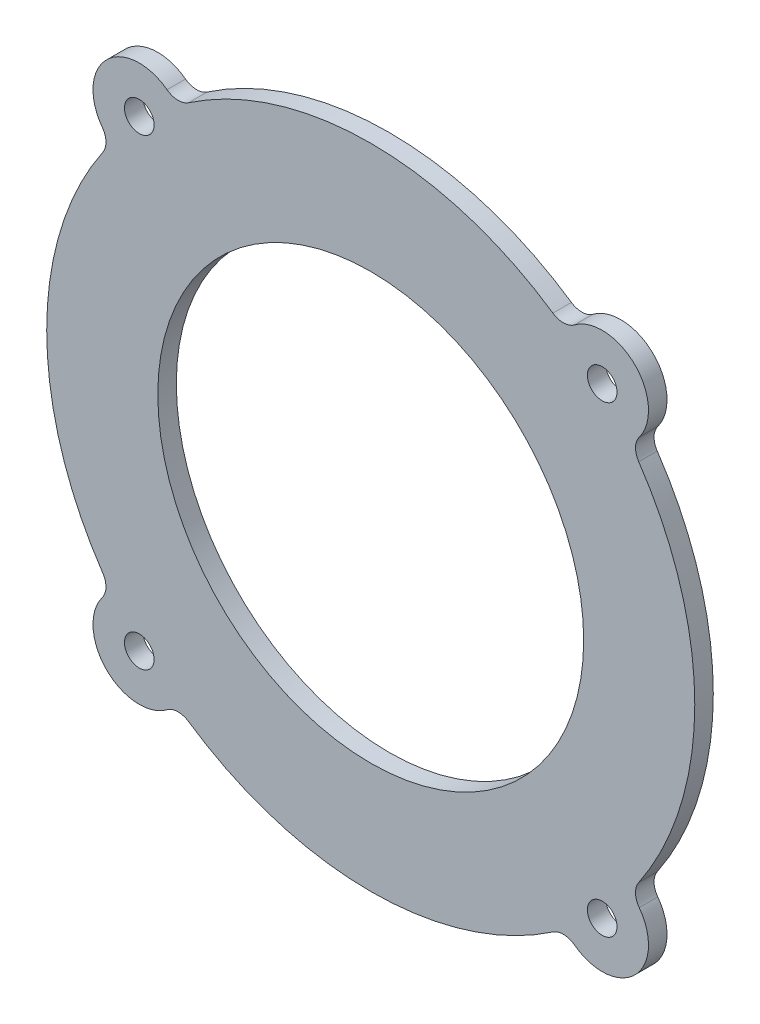
ISO-10303-21;
HEADER;
FILE_DESCRIPTION(('STEP AP214'),'2;1');
FILE_NAME('part.step','',(''),(''),'','','');
FILE_SCHEMA(('AUTOMOTIVE_DESIGN { 1 0 10303 214 1 1 1 1 }'));
ENDSEC;
DATA;
#1=APPLICATION_CONTEXT('core data for automotive mechanical design processes');
#2=APPLICATION_PROTOCOL_DEFINITION('international standard','automotive_design',2000,#1);
#3=PRODUCT_CONTEXT('',#1,'mechanical');
#4=PRODUCT('Part','Part','',(#3));
#5=PRODUCT_RELATED_PRODUCT_CATEGORY('part','',(#4));
#6=PRODUCT_DEFINITION_FORMATION('','',#4);
#7=PRODUCT_DEFINITION_CONTEXT('part definition',#1,'design');
#8=PRODUCT_DEFINITION('design','',#6,#7);
#9=PRODUCT_DEFINITION_SHAPE('','',#8);
#10=(LENGTH_UNIT() NAMED_UNIT(*) SI_UNIT(.MILLI.,.METRE.));
#11=(NAMED_UNIT(*) PLANE_ANGLE_UNIT() SI_UNIT($,.RADIAN.));
#12=(NAMED_UNIT(*) SI_UNIT($,.STERADIAN.) SOLID_ANGLE_UNIT());
#13=UNCERTAINTY_MEASURE_WITH_UNIT(LENGTH_MEASURE(1.E-05),#10,'distance_accuracy_value','');
#14=(GEOMETRIC_REPRESENTATION_CONTEXT(3) GLOBAL_UNCERTAINTY_ASSIGNED_CONTEXT((#13)) GLOBAL_UNIT_ASSIGNED_CONTEXT((#10,
#11,#12)) REPRESENTATION_CONTEXT('',''));
#15=CARTESIAN_POINT('',(0.,0.,0.));
#16=DIRECTION('',(0.,0.,1.));
#17=DIRECTION('',(1.,0.,0.));
#18=AXIS2_PLACEMENT_3D('',#15,#16,#17);
#19=CARTESIAN_POINT('',(-27.8,-22.9,2.));
#20=DIRECTION('',(0.,0.,-1.));
#21=DIRECTION('',(-1.,0.,0.));
#22=AXIS2_PLACEMENT_3D('',#19,#20,#21);
#23=PLANE('',#22);
#24=CARTESIAN_POINT('',(-30.6,-20.8,2.));
#25=DIRECTION('',(0.,0.,-1.));
#26=DIRECTION('',(-1.,0.,0.));
#27=AXIS2_PLACEMENT_3D('',#24,#25,#26);
#28=CIRCLE('',#27,2.);
#29=CARTESIAN_POINT('',(-28.945945945946,-19.6756756756757,2.));
#30=VERTEX_POINT('',#29);
#31=CARTESIAN_POINT('',(-29.,-22.,2.));
#32=VERTEX_POINT('',#31);
#33=EDGE_CURVE('E209',#30,#32,#28,.T.);
#34=ORIENTED_EDGE('',*,*,#33,.T.);
#35=CARTESIAN_POINT('',(-25.,-25.,2.));
#36=DIRECTION('',(0.,0.,1.));
#37=DIRECTION('',(1.,0.,0.));
#38=AXIS2_PLACEMENT_3D('',#35,#36,#37);
#39=CIRCLE('',#38,5.00000000000002);
#40=CARTESIAN_POINT('',(-22.,-29.,2.));
#41=VERTEX_POINT('',#40);
#42=EDGE_CURVE('E117',#32,#41,#39,.T.);
#43=ORIENTED_EDGE('',*,*,#42,.T.);
#44=CARTESIAN_POINT('',(-20.8,-30.6,2.));
#45=DIRECTION('',(0.,0.,-1.));
#46=DIRECTION('',(-1.,0.,0.));
#47=AXIS2_PLACEMENT_3D('',#44,#45,#46);
#48=CIRCLE('',#47,2.);
#49=CARTESIAN_POINT('',(-19.6756756756757,-28.945945945946,2.));
#50=VERTEX_POINT('',#49);
#51=EDGE_CURVE('E248',#41,#50,#48,.T.);
#52=ORIENTED_EDGE('',*,*,#51,.T.);
#53=CARTESIAN_POINT('',(0.,0.,2.));
#54=DIRECTION('',(0.,0.,1.));
#55=DIRECTION('',(1.,0.,0.));
#56=AXIS2_PLACEMENT_3D('',#53,#54,#55);
#57=CIRCLE('',#56,35.);
#58=CARTESIAN_POINT('',(19.6756756756757,-28.945945945946,2.));
#59=VERTEX_POINT('',#58);
#60=EDGE_CURVE('E267',#50,#59,#57,.T.);
#61=ORIENTED_EDGE('',*,*,#60,.T.);
#62=CARTESIAN_POINT('',(20.8,-30.6,2.));
#63=DIRECTION('',(0.,0.,-1.));
#64=DIRECTION('',(-1.,0.,0.));
#65=AXIS2_PLACEMENT_3D('',#62,#63,#64);
#66=CIRCLE('',#65,2.);
#67=CARTESIAN_POINT('',(22.,-29.,2.));
#68=VERTEX_POINT('',#67);
#69=EDGE_CURVE('E264',#59,#68,#66,.T.);
#70=ORIENTED_EDGE('',*,*,#69,.T.);
#71=CARTESIAN_POINT('',(25.,-25.,2.));
#72=DIRECTION('',(0.,0.,1.));
#73=DIRECTION('',(1.,0.,0.));
#74=AXIS2_PLACEMENT_3D('',#71,#72,#73);
#75=CIRCLE('',#74,5.00000000000002);
#76=CARTESIAN_POINT('',(29.,-22.,2.));
#77=VERTEX_POINT('',#76);
#78=EDGE_CURVE('E266',#68,#77,#75,.T.);
#79=ORIENTED_EDGE('',*,*,#78,.T.);
#80=CARTESIAN_POINT('',(30.6,-20.8,2.));
#81=DIRECTION('',(0.,0.,-1.));
#82=DIRECTION('',(-1.,0.,0.));
#83=AXIS2_PLACEMENT_3D('',#80,#81,#82);
#84=CIRCLE('',#83,2.);
#85=CARTESIAN_POINT('',(28.945945945946,-19.6756756756757,2.));
#86=VERTEX_POINT('',#85);
#87=EDGE_CURVE('E269',#77,#86,#84,.T.);
#88=ORIENTED_EDGE('',*,*,#87,.T.);
#89=CARTESIAN_POINT('',(0.,0.,2.));
#90=DIRECTION('',(0.,0.,1.));
#91=DIRECTION('',(1.,0.,0.));
#92=AXIS2_PLACEMENT_3D('',#89,#90,#91);
#93=CIRCLE('',#92,35.);
#94=CARTESIAN_POINT('',(28.9459459459459,19.6756756756757,2.));
#95=VERTEX_POINT('',#94);
#96=EDGE_CURVE('E275',#86,#95,#93,.T.);
#97=ORIENTED_EDGE('',*,*,#96,.T.);
#98=CARTESIAN_POINT('',(30.6,20.8,2.));
#99=DIRECTION('',(0.,0.,-1.));
#100=DIRECTION('',(-1.,0.,0.));
#101=AXIS2_PLACEMENT_3D('',#98,#99,#100);
#102=CIRCLE('',#101,2.);
#103=CARTESIAN_POINT('',(29.,22.,2.));
#104=VERTEX_POINT('',#103);
#105=EDGE_CURVE('E277',#95,#104,#102,.T.);
#106=ORIENTED_EDGE('',*,*,#105,.T.);
#107=CARTESIAN_POINT('',(25.,25.,2.));
#108=DIRECTION('',(0.,0.,1.));
#109=DIRECTION('',(1.,0.,0.));
#110=AXIS2_PLACEMENT_3D('',#107,#108,#109);
#111=CIRCLE('',#110,5.00000000000001);
#112=CARTESIAN_POINT('',(22.,29.,2.));
#113=VERTEX_POINT('',#112);
#114=EDGE_CURVE('E279',#104,#113,#111,.T.);
#115=ORIENTED_EDGE('',*,*,#114,.T.);
#116=CARTESIAN_POINT('',(20.8,30.6,2.));
#117=DIRECTION('',(0.,0.,-1.));
#118=DIRECTION('',(-1.,0.,0.));
#119=AXIS2_PLACEMENT_3D('',#116,#117,#118);
#120=CIRCLE('',#119,2.);
#121=CARTESIAN_POINT('',(19.6756756756757,28.945945945946,2.));
#122=VERTEX_POINT('',#121);
#123=EDGE_CURVE('E281',#113,#122,#120,.T.);
#124=ORIENTED_EDGE('',*,*,#123,.T.);
#125=CARTESIAN_POINT('',(0.,0.,2.));
#126=DIRECTION('',(0.,0.,1.));
#127=DIRECTION('',(1.,0.,0.));
#128=AXIS2_PLACEMENT_3D('',#125,#126,#127);
#129=CIRCLE('',#128,35.);
#130=CARTESIAN_POINT('',(-19.6756756756757,28.9459459459459,2.));
#131=VERTEX_POINT('',#130);
#132=EDGE_CURVE('E283',#122,#131,#129,.T.);
#133=ORIENTED_EDGE('',*,*,#132,.T.);
#134=CARTESIAN_POINT('',(-20.8,30.6,2.));
#135=DIRECTION('',(0.,0.,-1.));
#136=DIRECTION('',(-1.,0.,0.));
#137=AXIS2_PLACEMENT_3D('',#134,#135,#136);
#138=CIRCLE('',#137,2.);
#139=CARTESIAN_POINT('',(-22.,29.,2.));
#140=VERTEX_POINT('',#139);
#141=EDGE_CURVE('E160',#131,#140,#138,.T.);
#142=ORIENTED_EDGE('',*,*,#141,.T.);
#143=CARTESIAN_POINT('',(-25.,25.,2.));
#144=DIRECTION('',(0.,0.,1.));
#145=DIRECTION('',(1.,0.,0.));
#146=AXIS2_PLACEMENT_3D('',#143,#144,#145);
#147=CIRCLE('',#146,4.99999999999999);
#148=CARTESIAN_POINT('',(-29.,22.,2.));
#149=VERTEX_POINT('',#148);
#150=EDGE_CURVE('E154',#140,#149,#147,.T.);
#151=ORIENTED_EDGE('',*,*,#150,.T.);
#152=CARTESIAN_POINT('',(-30.6,20.8,2.));
#153=DIRECTION('',(0.,0.,-1.));
#154=DIRECTION('',(1.,0.,0.));
#155=AXIS2_PLACEMENT_3D('',#152,#153,#154);
#156=CIRCLE('',#155,2.);
#157=CARTESIAN_POINT('',(-28.945945945946,19.6756756756757,2.));
#158=VERTEX_POINT('',#157);
#159=EDGE_CURVE('E158',#149,#158,#156,.T.);
#160=ORIENTED_EDGE('',*,*,#159,.T.);
#161=CARTESIAN_POINT('',(0.,0.,2.));
#162=DIRECTION('',(0.,0.,1.));
#163=DIRECTION('',(1.,0.,0.));
#164=AXIS2_PLACEMENT_3D('',#161,#162,#163);
#165=CIRCLE('',#164,35.);
#166=EDGE_CURVE('E50',#158,#30,#165,.T.);
#167=ORIENTED_EDGE('',*,*,#166,.T.);
#168=EDGE_LOOP('',(#34,#43,#52,#61,#70,#79,#88,#97,#106,#115,#124,#133,#142,#151,#160,#167));
#169=FACE_BOUND('',#168,.T.);
#170=CARTESIAN_POINT('',(0.,0.,2.));
#171=DIRECTION('',(0.,0.,1.));
#172=DIRECTION('',(1.,0.,0.));
#173=AXIS2_PLACEMENT_3D('',#170,#171,#172);
#174=CIRCLE('',#173,23.);
#175=CARTESIAN_POINT('',(23.,0.,2.));
#176=VERTEX_POINT('',#175);
#177=EDGE_CURVE('E182',#176,#176,#174,.T.);
#178=ORIENTED_EDGE('',*,*,#177,.F.);
#179=EDGE_LOOP('',(#178));
#180=FACE_BOUND('',#179,.T.);
#181=CARTESIAN_POINT('',(-25.,25.,2.));
#182=DIRECTION('',(0.,0.,1.));
#183=DIRECTION('',(1.,0.,0.));
#184=AXIS2_PLACEMENT_3D('',#181,#182,#183);
#185=CIRCLE('',#184,1.6);
#186=CARTESIAN_POINT('',(-23.4,25.,2.));
#187=VERTEX_POINT('',#186);
#188=EDGE_CURVE('E357',#187,#187,#185,.T.);
#189=ORIENTED_EDGE('',*,*,#188,.F.);
#190=EDGE_LOOP('',(#189));
#191=FACE_BOUND('',#190,.T.);
#192=CARTESIAN_POINT('',(25.,25.,2.));
#193=DIRECTION('',(0.,0.,1.));
#194=DIRECTION('',(1.,0.,0.));
#195=AXIS2_PLACEMENT_3D('',#192,#193,#194);
#196=CIRCLE('',#195,1.6);
#197=CARTESIAN_POINT('',(26.6,25.,2.));
#198=VERTEX_POINT('',#197);
#199=EDGE_CURVE('E351',#198,#198,#196,.T.);
#200=ORIENTED_EDGE('',*,*,#199,.F.);
#201=EDGE_LOOP('',(#200));
#202=FACE_BOUND('',#201,.T.);
#203=CARTESIAN_POINT('',(-25.,-25.,2.));
#204=DIRECTION('',(0.,0.,1.));
#205=DIRECTION('',(1.,0.,0.));
#206=AXIS2_PLACEMENT_3D('',#203,#204,#205);
#207=CIRCLE('',#206,1.6);
#208=CARTESIAN_POINT('',(-23.4,-25.,2.));
#209=VERTEX_POINT('',#208);
#210=EDGE_CURVE('E345',#209,#209,#207,.T.);
#211=ORIENTED_EDGE('',*,*,#210,.F.);
#212=EDGE_LOOP('',(#211));
#213=FACE_BOUND('',#212,.T.);
#214=CARTESIAN_POINT('',(25.,-25.,2.));
#215=DIRECTION('',(0.,0.,1.));
#216=DIRECTION('',(1.,0.,0.));
#217=AXIS2_PLACEMENT_3D('',#214,#215,#216);
#218=CIRCLE('',#217,1.6);
#219=CARTESIAN_POINT('',(26.6,-25.,2.));
#220=VERTEX_POINT('',#219);
#221=EDGE_CURVE('E336',#220,#220,#218,.T.);
#222=ORIENTED_EDGE('',*,*,#221,.F.);
#223=EDGE_LOOP('',(#222));
#224=FACE_BOUND('',#223,.T.);
#225=ADVANCED_FACE('F33',(#169,#180,#191,#202,#213,#224),#23,.F.);
#226=CARTESIAN_POINT('',(-27.8,-22.9,0.));
#227=DIRECTION('',(0.,0.,-1.));
#228=DIRECTION('',(-1.,0.,0.));
#229=AXIS2_PLACEMENT_3D('',#226,#227,#228);
#230=PLANE('',#229);
#231=CARTESIAN_POINT('',(-25.,-25.,0.));
#232=DIRECTION('',(0.,0.,1.));
#233=DIRECTION('',(1.,0.,0.));
#234=AXIS2_PLACEMENT_3D('',#231,#232,#233);
#235=CIRCLE('',#234,1.6);
#236=CARTESIAN_POINT('',(-23.4,-25.,0.));
#237=VERTEX_POINT('',#236);
#238=EDGE_CURVE('E342',#237,#237,#235,.T.);
#239=ORIENTED_EDGE('',*,*,#238,.T.);
#240=EDGE_LOOP('',(#239));
#241=FACE_BOUND('',#240,.T.);
#242=CARTESIAN_POINT('',(-25.,25.,0.));
#243=DIRECTION('',(0.,0.,1.));
#244=DIRECTION('',(1.,0.,0.));
#245=AXIS2_PLACEMENT_3D('',#242,#243,#244);
#246=CIRCLE('',#245,1.6);
#247=CARTESIAN_POINT('',(-23.4,25.,0.));
#248=VERTEX_POINT('',#247);
#249=EDGE_CURVE('E354',#248,#248,#246,.T.);
#250=ORIENTED_EDGE('',*,*,#249,.T.);
#251=EDGE_LOOP('',(#250));
#252=FACE_BOUND('',#251,.T.);
#253=CARTESIAN_POINT('',(-30.6,-20.8,0.));
#254=DIRECTION('',(0.,0.,-1.));
#255=DIRECTION('',(-1.,0.,0.));
#256=AXIS2_PLACEMENT_3D('',#253,#254,#255);
#257=CIRCLE('',#256,2.);
#258=CARTESIAN_POINT('',(-28.945945945946,-19.6756756756757,0.));
#259=VERTEX_POINT('',#258);
#260=CARTESIAN_POINT('',(-29.,-22.,0.));
#261=VERTEX_POINT('',#260);
#262=EDGE_CURVE('E178',#259,#261,#257,.T.);
#263=ORIENTED_EDGE('',*,*,#262,.F.);
#264=CARTESIAN_POINT('',(0.,0.,0.));
#265=DIRECTION('',(0.,0.,1.));
#266=DIRECTION('',(1.,0.,0.));
#267=AXIS2_PLACEMENT_3D('',#264,#265,#266);
#268=CIRCLE('',#267,35.);
#269=CARTESIAN_POINT('',(-28.945945945946,19.6756756756757,0.));
#270=VERTEX_POINT('',#269);
#271=EDGE_CURVE('E109',#270,#259,#268,.T.);
#272=ORIENTED_EDGE('',*,*,#271,.F.);
#273=CARTESIAN_POINT('',(-30.6,20.8,0.));
#274=DIRECTION('',(0.,0.,-1.));
#275=DIRECTION('',(1.,0.,0.));
#276=AXIS2_PLACEMENT_3D('',#273,#274,#275);
#277=CIRCLE('',#276,2.);
#278=CARTESIAN_POINT('',(-29.,22.,0.));
#279=VERTEX_POINT('',#278);
#280=EDGE_CURVE('E103',#279,#270,#277,.T.);
#281=ORIENTED_EDGE('',*,*,#280,.F.);
#282=CARTESIAN_POINT('',(-25.,25.,0.));
#283=DIRECTION('',(0.,0.,1.));
#284=DIRECTION('',(1.,0.,0.));
#285=AXIS2_PLACEMENT_3D('',#282,#283,#284);
#286=CIRCLE('',#285,4.99999999999999);
#287=CARTESIAN_POINT('',(-22.,29.,0.));
#288=VERTEX_POINT('',#287);
#289=EDGE_CURVE('E168',#288,#279,#286,.T.);
#290=ORIENTED_EDGE('',*,*,#289,.F.);
#291=CARTESIAN_POINT('',(-20.8,30.6,0.));
#292=DIRECTION('',(0.,0.,-1.));
#293=DIRECTION('',(-1.,0.,0.));
#294=AXIS2_PLACEMENT_3D('',#291,#292,#293);
#295=CIRCLE('',#294,2.);
#296=CARTESIAN_POINT('',(-19.6756756756757,28.9459459459459,0.));
#297=VERTEX_POINT('',#296);
#298=EDGE_CURVE('E204',#297,#288,#295,.T.);
#299=ORIENTED_EDGE('',*,*,#298,.F.);
#300=CARTESIAN_POINT('',(0.,0.,0.));
#301=DIRECTION('',(0.,0.,1.));
#302=DIRECTION('',(1.,0.,0.));
#303=AXIS2_PLACEMENT_3D('',#300,#301,#302);
#304=CIRCLE('',#303,35.);
#305=CARTESIAN_POINT('',(19.6756756756757,28.945945945946,0.));
#306=VERTEX_POINT('',#305);
#307=EDGE_CURVE('E202',#306,#297,#304,.T.);
#308=ORIENTED_EDGE('',*,*,#307,.F.);
#309=CARTESIAN_POINT('',(20.8,30.6,0.));
#310=DIRECTION('',(0.,0.,-1.));
#311=DIRECTION('',(-1.,0.,0.));
#312=AXIS2_PLACEMENT_3D('',#309,#310,#311);
#313=CIRCLE('',#312,2.);
#314=CARTESIAN_POINT('',(22.,29.,0.));
#315=VERTEX_POINT('',#314);
#316=EDGE_CURVE('E200',#315,#306,#313,.T.);
#317=ORIENTED_EDGE('',*,*,#316,.F.);
#318=CARTESIAN_POINT('',(25.,25.,0.));
#319=DIRECTION('',(0.,0.,1.));
#320=DIRECTION('',(1.,0.,0.));
#321=AXIS2_PLACEMENT_3D('',#318,#319,#320);
#322=CIRCLE('',#321,5.00000000000001);
#323=CARTESIAN_POINT('',(29.,22.,0.));
#324=VERTEX_POINT('',#323);
#325=EDGE_CURVE('E198',#324,#315,#322,.T.);
#326=ORIENTED_EDGE('',*,*,#325,.F.);
#327=CARTESIAN_POINT('',(30.6,20.8,0.));
#328=DIRECTION('',(0.,0.,-1.));
#329=DIRECTION('',(-1.,0.,0.));
#330=AXIS2_PLACEMENT_3D('',#327,#328,#329);
#331=CIRCLE('',#330,2.);
#332=CARTESIAN_POINT('',(28.9459459459459,19.6756756756757,0.));
#333=VERTEX_POINT('',#332);
#334=EDGE_CURVE('E196',#333,#324,#331,.T.);
#335=ORIENTED_EDGE('',*,*,#334,.F.);
#336=CARTESIAN_POINT('',(0.,0.,0.));
#337=DIRECTION('',(0.,0.,1.));
#338=DIRECTION('',(1.,0.,0.));
#339=AXIS2_PLACEMENT_3D('',#336,#337,#338);
#340=CIRCLE('',#339,35.);
#341=CARTESIAN_POINT('',(28.945945945946,-19.6756756756757,0.));
#342=VERTEX_POINT('',#341);
#343=EDGE_CURVE('E194',#342,#333,#340,.T.);
#344=ORIENTED_EDGE('',*,*,#343,.F.);
#345=CARTESIAN_POINT('',(30.6,-20.8,0.));
#346=DIRECTION('',(0.,0.,-1.));
#347=DIRECTION('',(-1.,0.,0.));
#348=AXIS2_PLACEMENT_3D('',#345,#346,#347);
#349=CIRCLE('',#348,2.);
#350=CARTESIAN_POINT('',(29.,-22.,0.));
#351=VERTEX_POINT('',#350);
#352=EDGE_CURVE('E192',#351,#342,#349,.T.);
#353=ORIENTED_EDGE('',*,*,#352,.F.);
#354=CARTESIAN_POINT('',(25.,-25.,0.));
#355=DIRECTION('',(0.,0.,1.));
#356=DIRECTION('',(1.,0.,0.));
#357=AXIS2_PLACEMENT_3D('',#354,#355,#356);
#358=CIRCLE('',#357,5.00000000000002);
#359=CARTESIAN_POINT('',(22.,-29.,0.));
#360=VERTEX_POINT('',#359);
#361=EDGE_CURVE('E190',#360,#351,#358,.T.);
#362=ORIENTED_EDGE('',*,*,#361,.F.);
#363=CARTESIAN_POINT('',(20.8,-30.6,0.));
#364=DIRECTION('',(0.,0.,-1.));
#365=DIRECTION('',(-1.,0.,0.));
#366=AXIS2_PLACEMENT_3D('',#363,#364,#365);
#367=CIRCLE('',#366,2.);
#368=CARTESIAN_POINT('',(19.6756756756757,-28.945945945946,0.));
#369=VERTEX_POINT('',#368);
#370=EDGE_CURVE('E188',#369,#360,#367,.T.);
#371=ORIENTED_EDGE('',*,*,#370,.F.);
#372=CARTESIAN_POINT('',(0.,0.,0.));
#373=DIRECTION('',(0.,0.,1.));
#374=DIRECTION('',(1.,0.,0.));
#375=AXIS2_PLACEMENT_3D('',#372,#373,#374);
#376=CIRCLE('',#375,35.);
#377=CARTESIAN_POINT('',(-19.6756756756757,-28.945945945946,0.));
#378=VERTEX_POINT('',#377);
#379=EDGE_CURVE('E186',#378,#369,#376,.T.);
#380=ORIENTED_EDGE('',*,*,#379,.F.);
#381=CARTESIAN_POINT('',(-20.8,-30.6,0.));
#382=DIRECTION('',(0.,0.,-1.));
#383=DIRECTION('',(-1.,0.,0.));
#384=AXIS2_PLACEMENT_3D('',#381,#382,#383);
#385=CIRCLE('',#384,2.);
#386=CARTESIAN_POINT('',(-22.,-29.,0.));
#387=VERTEX_POINT('',#386);
#388=EDGE_CURVE('E184',#387,#378,#385,.T.);
#389=ORIENTED_EDGE('',*,*,#388,.F.);
#390=CARTESIAN_POINT('',(-25.,-25.,0.));
#391=DIRECTION('',(0.,0.,1.));
#392=DIRECTION('',(1.,0.,0.));
#393=AXIS2_PLACEMENT_3D('',#390,#391,#392);
#394=CIRCLE('',#393,5.00000000000002);
#395=EDGE_CURVE('E181',#261,#387,#394,.T.);
#396=ORIENTED_EDGE('',*,*,#395,.F.);
#397=EDGE_LOOP('',(#263,#272,#281,#290,#299,#308,#317,#326,#335,#344,#353,#362,#371,#380,#389,#396));
#398=FACE_BOUND('',#397,.T.);
#399=CARTESIAN_POINT('',(0.,0.,0.));
#400=DIRECTION('',(0.,0.,1.));
#401=DIRECTION('',(1.,0.,0.));
#402=AXIS2_PLACEMENT_3D('',#399,#400,#401);
#403=CIRCLE('',#402,23.);
#404=CARTESIAN_POINT('',(23.,0.,0.));
#405=VERTEX_POINT('',#404);
#406=EDGE_CURVE('E360',#405,#405,#403,.T.);
#407=ORIENTED_EDGE('',*,*,#406,.T.);
#408=EDGE_LOOP('',(#407));
#409=FACE_BOUND('',#408,.T.);
#410=CARTESIAN_POINT('',(25.,25.,0.));
#411=DIRECTION('',(0.,0.,1.));
#412=DIRECTION('',(1.,0.,0.));
#413=AXIS2_PLACEMENT_3D('',#410,#411,#412);
#414=CIRCLE('',#413,1.6);
#415=CARTESIAN_POINT('',(26.6,25.,0.));
#416=VERTEX_POINT('',#415);
#417=EDGE_CURVE('E348',#416,#416,#414,.T.);
#418=ORIENTED_EDGE('',*,*,#417,.T.);
#419=EDGE_LOOP('',(#418));
#420=FACE_BOUND('',#419,.T.);
#421=CARTESIAN_POINT('',(25.,-25.,0.));
#422=DIRECTION('',(0.,0.,1.));
#423=DIRECTION('',(1.,0.,0.));
#424=AXIS2_PLACEMENT_3D('',#421,#422,#423);
#425=CIRCLE('',#424,1.6);
#426=CARTESIAN_POINT('',(26.6,-25.,0.));
#427=VERTEX_POINT('',#426);
#428=EDGE_CURVE('E339',#427,#427,#425,.T.);
#429=ORIENTED_EDGE('',*,*,#428,.T.);
#430=EDGE_LOOP('',(#429));
#431=FACE_BOUND('',#430,.T.);
#432=ADVANCED_FACE('F252',(#241,#252,#398,#409,#420,#431),#230,.T.);
#433=CARTESIAN_POINT('',(-30.6,-20.8,2.));
#434=DIRECTION('',(0.,0.,-1.));
#435=DIRECTION('',(-1.,0.,0.));
#436=AXIS2_PLACEMENT_3D('',#433,#434,#435);
#437=CYLINDRICAL_SURFACE('',#436,2.);
#438=ORIENTED_EDGE('',*,*,#262,.T.);
#439=DIRECTION('',(0.,0.,-1.));
#440=VECTOR('',#439,1.);
#441=CARTESIAN_POINT('',(-29.,-22.,2.));
#442=LINE('',#441,#440);
#443=EDGE_CURVE('E11',#32,#261,#442,.T.);
#444=ORIENTED_EDGE('',*,*,#443,.F.);
#445=ORIENTED_EDGE('',*,*,#33,.F.);
#446=DIRECTION('',(0.,0.,-1.));
#447=VECTOR('',#446,1.);
#448=CARTESIAN_POINT('',(-28.945945945946,-19.6756756756757,2.));
#449=LINE('',#448,#447);
#450=EDGE_CURVE('E174',#30,#259,#449,.T.);
#451=ORIENTED_EDGE('',*,*,#450,.T.);
#452=EDGE_LOOP('',(#438,#444,#445,#451));
#453=FACE_BOUND('',#452,.T.);
#454=ADVANCED_FACE('F35',(#453),#437,.F.);
#455=CARTESIAN_POINT('',(-25.,-25.,2.));
#456=DIRECTION('',(0.,0.,-1.));
#457=DIRECTION('',(-1.,0.,0.));
#458=AXIS2_PLACEMENT_3D('',#455,#456,#457);
#459=CYLINDRICAL_SURFACE('',#458,5.00000000000002);
#460=ORIENTED_EDGE('',*,*,#395,.T.);
#461=DIRECTION('',(0.,0.,-1.));
#462=VECTOR('',#461,1.);
#463=CARTESIAN_POINT('',(-22.,-29.,2.));
#464=LINE('',#463,#462);
#465=EDGE_CURVE('E42',#41,#387,#464,.T.);
#466=ORIENTED_EDGE('',*,*,#465,.F.);
#467=ORIENTED_EDGE('',*,*,#42,.F.);
#468=ORIENTED_EDGE('',*,*,#443,.T.);
#469=EDGE_LOOP('',(#460,#466,#467,#468));
#470=FACE_BOUND('',#469,.T.);
#471=ADVANCED_FACE('F521',(#470),#459,.T.);
#472=CARTESIAN_POINT('',(-20.8,-30.6,2.));
#473=DIRECTION('',(0.,0.,-1.));
#474=DIRECTION('',(-1.,0.,0.));
#475=AXIS2_PLACEMENT_3D('',#472,#473,#474);
#476=CYLINDRICAL_SURFACE('',#475,2.);
#477=ORIENTED_EDGE('',*,*,#388,.T.);
#478=DIRECTION('',(0.,0.,-1.));
#479=VECTOR('',#478,1.);
#480=CARTESIAN_POINT('',(-19.6756756756757,-28.945945945946,2.));
#481=LINE('',#480,#479);
#482=EDGE_CURVE('E240',#50,#378,#481,.T.);
#483=ORIENTED_EDGE('',*,*,#482,.F.);
#484=ORIENTED_EDGE('',*,*,#51,.F.);
#485=ORIENTED_EDGE('',*,*,#465,.T.);
#486=EDGE_LOOP('',(#477,#483,#484,#485));
#487=FACE_BOUND('',#486,.T.);
#488=ADVANCED_FACE('F246',(#487),#476,.F.);
#489=CARTESIAN_POINT('',(0.,0.,2.));
#490=DIRECTION('',(0.,0.,-1.));
#491=DIRECTION('',(-1.,0.,0.));
#492=AXIS2_PLACEMENT_3D('',#489,#490,#491);
#493=CYLINDRICAL_SURFACE('',#492,35.);
#494=ORIENTED_EDGE('',*,*,#379,.T.);
#495=DIRECTION('',(0.,0.,-1.));
#496=VECTOR('',#495,1.);
#497=CARTESIAN_POINT('',(19.6756756756757,-28.945945945946,2.));
#498=LINE('',#497,#496);
#499=EDGE_CURVE('E237',#59,#369,#498,.T.);
#500=ORIENTED_EDGE('',*,*,#499,.F.);
#501=ORIENTED_EDGE('',*,*,#60,.F.);
#502=ORIENTED_EDGE('',*,*,#482,.T.);
#503=EDGE_LOOP('',(#494,#500,#501,#502));
#504=FACE_BOUND('',#503,.T.);
#505=ADVANCED_FACE('F258',(#504),#493,.T.);
#506=CARTESIAN_POINT('',(20.8,-30.6,2.));
#507=DIRECTION('',(0.,0.,-1.));
#508=DIRECTION('',(-1.,0.,0.));
#509=AXIS2_PLACEMENT_3D('',#506,#507,#508);
#510=CYLINDRICAL_SURFACE('',#509,2.);
#511=ORIENTED_EDGE('',*,*,#370,.T.);
#512=DIRECTION('',(0.,0.,-1.));
#513=VECTOR('',#512,1.);
#514=CARTESIAN_POINT('',(22.,-29.,2.));
#515=LINE('',#514,#513);
#516=EDGE_CURVE('E234',#68,#360,#515,.T.);
#517=ORIENTED_EDGE('',*,*,#516,.F.);
#518=ORIENTED_EDGE('',*,*,#69,.F.);
#519=ORIENTED_EDGE('',*,*,#499,.T.);
#520=EDGE_LOOP('',(#511,#517,#518,#519));
#521=FACE_BOUND('',#520,.T.);
#522=ADVANCED_FACE('F262',(#521),#510,.F.);
#523=CARTESIAN_POINT('',(25.,-25.,2.));
#524=DIRECTION('',(0.,0.,-1.));
#525=DIRECTION('',(-1.,0.,0.));
#526=AXIS2_PLACEMENT_3D('',#523,#524,#525);
#527=CYLINDRICAL_SURFACE('',#526,5.00000000000002);
#528=ORIENTED_EDGE('',*,*,#361,.T.);
#529=DIRECTION('',(0.,0.,-1.));
#530=VECTOR('',#529,1.);
#531=CARTESIAN_POINT('',(29.,-22.,2.));
#532=LINE('',#531,#530);
#533=EDGE_CURVE('E231',#77,#351,#532,.T.);
#534=ORIENTED_EDGE('',*,*,#533,.F.);
#535=ORIENTED_EDGE('',*,*,#78,.F.);
#536=ORIENTED_EDGE('',*,*,#516,.T.);
#537=EDGE_LOOP('',(#528,#534,#535,#536));
#538=FACE_BOUND('',#537,.T.);
#539=ADVANCED_FACE('F486',(#538),#527,.T.);
#540=CARTESIAN_POINT('',(30.6,-20.8,2.));
#541=DIRECTION('',(0.,0.,-1.));
#542=DIRECTION('',(-1.,0.,0.));
#543=AXIS2_PLACEMENT_3D('',#540,#541,#542);
#544=CYLINDRICAL_SURFACE('',#543,2.);
#545=ORIENTED_EDGE('',*,*,#352,.T.);
#546=DIRECTION('',(0.,0.,-1.));
#547=VECTOR('',#546,1.);
#548=CARTESIAN_POINT('',(28.945945945946,-19.6756756756757,2.));
#549=LINE('',#548,#547);
#550=EDGE_CURVE('E228',#86,#342,#549,.T.);
#551=ORIENTED_EDGE('',*,*,#550,.F.);
#552=ORIENTED_EDGE('',*,*,#87,.F.);
#553=ORIENTED_EDGE('',*,*,#533,.T.);
#554=EDGE_LOOP('',(#545,#551,#552,#553));
#555=FACE_BOUND('',#554,.T.);
#556=ADVANCED_FACE('F476',(#555),#544,.F.);
#557=CARTESIAN_POINT('',(0.,0.,2.));
#558=DIRECTION('',(0.,0.,-1.));
#559=DIRECTION('',(-1.,0.,0.));
#560=AXIS2_PLACEMENT_3D('',#557,#558,#559);
#561=CYLINDRICAL_SURFACE('',#560,35.);
#562=ORIENTED_EDGE('',*,*,#343,.T.);
#563=DIRECTION('',(0.,0.,-1.));
#564=VECTOR('',#563,1.);
#565=CARTESIAN_POINT('',(28.9459459459459,19.6756756756757,2.));
#566=LINE('',#565,#564);
#567=EDGE_CURVE('E225',#95,#333,#566,.T.);
#568=ORIENTED_EDGE('',*,*,#567,.F.);
#569=ORIENTED_EDGE('',*,*,#96,.F.);
#570=ORIENTED_EDGE('',*,*,#550,.T.);
#571=EDGE_LOOP('',(#562,#568,#569,#570));
#572=FACE_BOUND('',#571,.T.);
#573=ADVANCED_FACE('F466',(#572),#561,.T.);
#574=CARTESIAN_POINT('',(30.6,20.8,2.));
#575=DIRECTION('',(0.,0.,-1.));
#576=DIRECTION('',(-1.,0.,0.));
#577=AXIS2_PLACEMENT_3D('',#574,#575,#576);
#578=CYLINDRICAL_SURFACE('',#577,2.);
#579=ORIENTED_EDGE('',*,*,#334,.T.);
#580=DIRECTION('',(0.,0.,-1.));
#581=VECTOR('',#580,1.);
#582=CARTESIAN_POINT('',(29.,22.,2.));
#583=LINE('',#582,#581);
#584=EDGE_CURVE('E222',#104,#324,#583,.T.);
#585=ORIENTED_EDGE('',*,*,#584,.F.);
#586=ORIENTED_EDGE('',*,*,#105,.F.);
#587=ORIENTED_EDGE('',*,*,#567,.T.);
#588=EDGE_LOOP('',(#579,#585,#586,#587));
#589=FACE_BOUND('',#588,.T.);
#590=ADVANCED_FACE('F456',(#589),#578,.F.);
#591=CARTESIAN_POINT('',(25.,25.,2.));
#592=DIRECTION('',(0.,0.,-1.));
#593=DIRECTION('',(-1.,0.,0.));
#594=AXIS2_PLACEMENT_3D('',#591,#592,#593);
#595=CYLINDRICAL_SURFACE('',#594,5.00000000000001);
#596=ORIENTED_EDGE('',*,*,#325,.T.);
#597=DIRECTION('',(0.,0.,-1.));
#598=VECTOR('',#597,1.);
#599=CARTESIAN_POINT('',(22.,29.,2.));
#600=LINE('',#599,#598);
#601=EDGE_CURVE('E219',#113,#315,#600,.T.);
#602=ORIENTED_EDGE('',*,*,#601,.F.);
#603=ORIENTED_EDGE('',*,*,#114,.F.);
#604=ORIENTED_EDGE('',*,*,#584,.T.);
#605=EDGE_LOOP('',(#596,#602,#603,#604));
#606=FACE_BOUND('',#605,.T.);
#607=ADVANCED_FACE('F446',(#606),#595,.T.);
#608=CARTESIAN_POINT('',(20.8,30.6,2.));
#609=DIRECTION('',(0.,0.,-1.));
#610=DIRECTION('',(-1.,0.,0.));
#611=AXIS2_PLACEMENT_3D('',#608,#609,#610);
#612=CYLINDRICAL_SURFACE('',#611,2.);
#613=ORIENTED_EDGE('',*,*,#316,.T.);
#614=DIRECTION('',(0.,0.,-1.));
#615=VECTOR('',#614,1.);
#616=CARTESIAN_POINT('',(19.6756756756757,28.945945945946,2.));
#617=LINE('',#616,#615);
#618=EDGE_CURVE('E216',#122,#306,#617,.T.);
#619=ORIENTED_EDGE('',*,*,#618,.F.);
#620=ORIENTED_EDGE('',*,*,#123,.F.);
#621=ORIENTED_EDGE('',*,*,#601,.T.);
#622=EDGE_LOOP('',(#613,#619,#620,#621));
#623=FACE_BOUND('',#622,.T.);
#624=ADVANCED_FACE('F437',(#623),#612,.F.);
#625=CARTESIAN_POINT('',(0.,0.,2.));
#626=DIRECTION('',(0.,0.,-1.));
#627=DIRECTION('',(-1.,0.,0.));
#628=AXIS2_PLACEMENT_3D('',#625,#626,#627);
#629=CYLINDRICAL_SURFACE('',#628,35.);
#630=ORIENTED_EDGE('',*,*,#307,.T.);
#631=DIRECTION('',(0.,0.,-1.));
#632=VECTOR('',#631,1.);
#633=CARTESIAN_POINT('',(-19.6756756756757,28.9459459459459,2.));
#634=LINE('',#633,#632);
#635=EDGE_CURVE('E213',#131,#297,#634,.T.);
#636=ORIENTED_EDGE('',*,*,#635,.F.);
#637=ORIENTED_EDGE('',*,*,#132,.F.);
#638=ORIENTED_EDGE('',*,*,#618,.T.);
#639=EDGE_LOOP('',(#630,#636,#637,#638));
#640=FACE_BOUND('',#639,.T.);
#641=ADVANCED_FACE('F289',(#640),#629,.T.);
#642=CARTESIAN_POINT('',(-20.8,30.6,2.));
#643=DIRECTION('',(0.,0.,-1.));
#644=DIRECTION('',(-1.,0.,0.));
#645=AXIS2_PLACEMENT_3D('',#642,#643,#644);
#646=CYLINDRICAL_SURFACE('',#645,2.);
#647=ORIENTED_EDGE('',*,*,#298,.T.);
#648=DIRECTION('',(0.,0.,-1.));
#649=VECTOR('',#648,1.);
#650=CARTESIAN_POINT('',(-22.,29.,2.));
#651=LINE('',#650,#649);
#652=EDGE_CURVE('E169',#140,#288,#651,.T.);
#653=ORIENTED_EDGE('',*,*,#652,.F.);
#654=ORIENTED_EDGE('',*,*,#141,.F.);
#655=ORIENTED_EDGE('',*,*,#635,.T.);
#656=EDGE_LOOP('',(#647,#653,#654,#655));
#657=FACE_BOUND('',#656,.T.);
#658=ADVANCED_FACE('F293',(#657),#646,.F.);
#659=CARTESIAN_POINT('',(-25.,25.,2.));
#660=DIRECTION('',(0.,0.,-1.));
#661=DIRECTION('',(-1.,0.,0.));
#662=AXIS2_PLACEMENT_3D('',#659,#660,#661);
#663=CYLINDRICAL_SURFACE('',#662,4.99999999999999);
#664=ORIENTED_EDGE('',*,*,#289,.T.);
#665=DIRECTION('',(0.,0.,-1.));
#666=VECTOR('',#665,1.);
#667=CARTESIAN_POINT('',(-29.,22.,2.));
#668=LINE('',#667,#666);
#669=EDGE_CURVE('E165',#149,#279,#668,.T.);
#670=ORIENTED_EDGE('',*,*,#669,.F.);
#671=ORIENTED_EDGE('',*,*,#150,.F.);
#672=ORIENTED_EDGE('',*,*,#652,.T.);
#673=EDGE_LOOP('',(#664,#670,#671,#672));
#674=FACE_BOUND('',#673,.T.);
#675=ADVANCED_FACE('F166',(#674),#663,.T.);
#676=CARTESIAN_POINT('',(-30.6,20.8,2.));
#677=DIRECTION('',(0.,0.,-1.));
#678=DIRECTION('',(-1.,0.,0.));
#679=AXIS2_PLACEMENT_3D('',#676,#677,#678);
#680=CYLINDRICAL_SURFACE('',#679,2.);
#681=ORIENTED_EDGE('',*,*,#280,.T.);
#682=DIRECTION('',(0.,0.,-1.));
#683=VECTOR('',#682,1.);
#684=CARTESIAN_POINT('',(-28.945945945946,19.6756756756757,2.));
#685=LINE('',#684,#683);
#686=EDGE_CURVE('E170',#158,#270,#685,.T.);
#687=ORIENTED_EDGE('',*,*,#686,.F.);
#688=ORIENTED_EDGE('',*,*,#159,.F.);
#689=ORIENTED_EDGE('',*,*,#669,.T.);
#690=EDGE_LOOP('',(#681,#687,#688,#689));
#691=FACE_BOUND('',#690,.T.);
#692=ADVANCED_FACE('F172',(#691),#680,.F.);
#693=CARTESIAN_POINT('',(0.,0.,2.));
#694=DIRECTION('',(0.,0.,-1.));
#695=DIRECTION('',(-1.,0.,0.));
#696=AXIS2_PLACEMENT_3D('',#693,#694,#695);
#697=CYLINDRICAL_SURFACE('',#696,35.);
#698=ORIENTED_EDGE('',*,*,#271,.T.);
#699=ORIENTED_EDGE('',*,*,#450,.F.);
#700=ORIENTED_EDGE('',*,*,#166,.F.);
#701=ORIENTED_EDGE('',*,*,#686,.T.);
#702=EDGE_LOOP('',(#698,#699,#700,#701));
#703=FACE_BOUND('',#702,.T.);
#704=ADVANCED_FACE('F297',(#703),#697,.T.);
#705=CARTESIAN_POINT('',(0.,0.,2.));
#706=DIRECTION('',(0.,0.,-1.));
#707=DIRECTION('',(-1.,0.,0.));
#708=AXIS2_PLACEMENT_3D('',#705,#706,#707);
#709=CYLINDRICAL_SURFACE('',#708,23.);
#710=ORIENTED_EDGE('',*,*,#177,.T.);
#711=EDGE_LOOP('',(#710));
#712=FACE_BOUND('',#711,.T.);
#713=ORIENTED_EDGE('',*,*,#406,.F.);
#714=EDGE_LOOP('',(#713));
#715=FACE_BOUND('',#714,.T.);
#716=ADVANCED_FACE('F299',(#712,#715),#709,.F.);
#717=CARTESIAN_POINT('',(-25.,25.,2.));
#718=DIRECTION('',(0.,0.,-1.));
#719=DIRECTION('',(-1.,0.,0.));
#720=AXIS2_PLACEMENT_3D('',#717,#718,#719);
#721=CYLINDRICAL_SURFACE('',#720,1.6);
#722=ORIENTED_EDGE('',*,*,#188,.T.);
#723=EDGE_LOOP('',(#722));
#724=FACE_BOUND('',#723,.T.);
#725=ORIENTED_EDGE('',*,*,#249,.F.);
#726=EDGE_LOOP('',(#725));
#727=FACE_BOUND('',#726,.T.);
#728=ADVANCED_FACE('F305',(#724,#727),#721,.F.);
#729=CARTESIAN_POINT('',(25.,25.,2.));
#730=DIRECTION('',(0.,0.,-1.));
#731=DIRECTION('',(-1.,0.,0.));
#732=AXIS2_PLACEMENT_3D('',#729,#730,#731);
#733=CYLINDRICAL_SURFACE('',#732,1.6);
#734=ORIENTED_EDGE('',*,*,#199,.T.);
#735=EDGE_LOOP('',(#734));
#736=FACE_BOUND('',#735,.T.);
#737=ORIENTED_EDGE('',*,*,#417,.F.);
#738=EDGE_LOOP('',(#737));
#739=FACE_BOUND('',#738,.T.);
#740=ADVANCED_FACE('F319',(#736,#739),#733,.F.);
#741=CARTESIAN_POINT('',(-25.,-25.,2.));
#742=DIRECTION('',(0.,0.,-1.));
#743=DIRECTION('',(-1.,0.,0.));
#744=AXIS2_PLACEMENT_3D('',#741,#742,#743);
#745=CYLINDRICAL_SURFACE('',#744,1.6);
#746=ORIENTED_EDGE('',*,*,#210,.T.);
#747=EDGE_LOOP('',(#746));
#748=FACE_BOUND('',#747,.T.);
#749=ORIENTED_EDGE('',*,*,#238,.F.);
#750=EDGE_LOOP('',(#749));
#751=FACE_BOUND('',#750,.T.);
#752=ADVANCED_FACE('F323',(#748,#751),#745,.F.);
#753=CARTESIAN_POINT('',(25.,-25.,2.));
#754=DIRECTION('',(0.,0.,-1.));
#755=DIRECTION('',(-1.,0.,0.));
#756=AXIS2_PLACEMENT_3D('',#753,#754,#755);
#757=CYLINDRICAL_SURFACE('',#756,1.6);
#758=ORIENTED_EDGE('',*,*,#221,.T.);
#759=EDGE_LOOP('',(#758));
#760=FACE_BOUND('',#759,.T.);
#761=ORIENTED_EDGE('',*,*,#428,.F.);
#762=EDGE_LOOP('',(#761));
#763=FACE_BOUND('',#762,.T.);
#764=ADVANCED_FACE('F327',(#760,#763),#757,.F.);
#765=CLOSED_SHELL('',(#225,#432,#454,#471,#488,#505,#522,#539,#556,#573,#590,#607,#624,#641,
#658,#675,#692,#704,#716,#728,#740,#752,#764));
#766=MANIFOLD_SOLID_BREP('B2',#765);
#767=ADVANCED_BREP_SHAPE_REPRESENTATION('',(#18,#766),#14);
#768=SHAPE_DEFINITION_REPRESENTATION(#9,#767);
ENDSEC;
END-ISO-10303-21;
